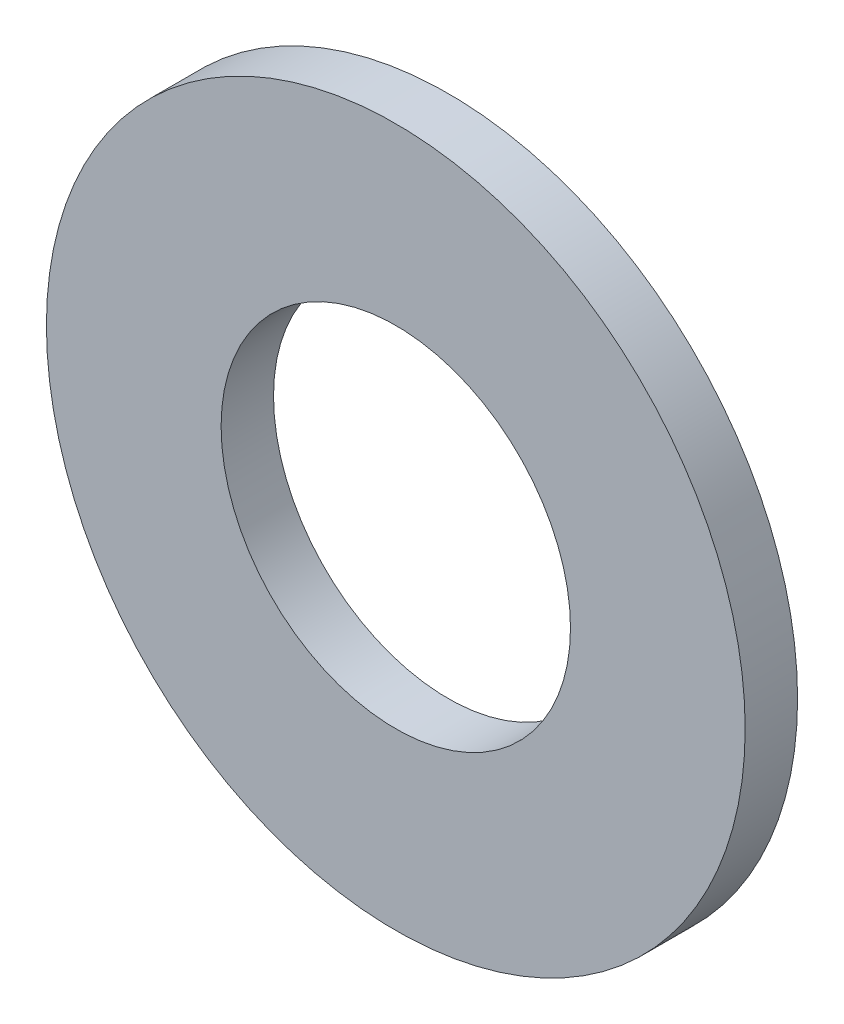
ISO-10303-21;
HEADER;
FILE_DESCRIPTION(('STEP AP214'),'2;1');
FILE_NAME('part.step','',(''),(''),'','','');
FILE_SCHEMA(('AUTOMOTIVE_DESIGN { 1 0 10303 214 1 1 1 1 }'));
ENDSEC;
DATA;
#1=APPLICATION_CONTEXT('core data for automotive mechanical design processes');
#2=APPLICATION_PROTOCOL_DEFINITION('international standard','automotive_design',2000,#1);
#3=PRODUCT_CONTEXT('',#1,'mechanical');
#4=PRODUCT('Part','Part','',(#3));
#5=PRODUCT_RELATED_PRODUCT_CATEGORY('part','',(#4));
#6=PRODUCT_DEFINITION_FORMATION('','',#4);
#7=PRODUCT_DEFINITION_CONTEXT('part definition',#1,'design');
#8=PRODUCT_DEFINITION('design','',#6,#7);
#9=PRODUCT_DEFINITION_SHAPE('','',#8);
#10=(LENGTH_UNIT() NAMED_UNIT(*) SI_UNIT(.MILLI.,.METRE.));
#11=(NAMED_UNIT(*) PLANE_ANGLE_UNIT() SI_UNIT($,.RADIAN.));
#12=(NAMED_UNIT(*) SI_UNIT($,.STERADIAN.) SOLID_ANGLE_UNIT());
#13=UNCERTAINTY_MEASURE_WITH_UNIT(LENGTH_MEASURE(1.E-05),#10,'distance_accuracy_value','');
#14=(GEOMETRIC_REPRESENTATION_CONTEXT(3) GLOBAL_UNCERTAINTY_ASSIGNED_CONTEXT((#13)) GLOBAL_UNIT_ASSIGNED_CONTEXT((#10,
#11,#12)) REPRESENTATION_CONTEXT('',''));
#15=CARTESIAN_POINT('',(0.,0.,0.));
#16=DIRECTION('',(0.,0.,1.));
#17=DIRECTION('',(1.,0.,0.));
#18=AXIS2_PLACEMENT_3D('',#15,#16,#17);
#19=CARTESIAN_POINT('',(0.,0.,0.15));
#20=DIRECTION('',(0.,0.,1.));
#21=DIRECTION('',(1.,0.,0.));
#22=AXIS2_PLACEMENT_3D('',#19,#20,#21);
#23=PLANE('',#22);
#24=CARTESIAN_POINT('',(0.,0.,0.15));
#25=DIRECTION('',(0.,0.,1.));
#26=DIRECTION('',(1.,0.,0.));
#27=AXIS2_PLACEMENT_3D('',#24,#25,#26);
#28=CIRCLE('',#27,2.);
#29=CARTESIAN_POINT('',(2.,0.,0.15));
#30=VERTEX_POINT('',#29);
#31=EDGE_CURVE('E10',#30,#30,#28,.T.);
#32=ORIENTED_EDGE('',*,*,#31,.T.);
#33=EDGE_LOOP('',(#32));
#34=FACE_BOUND('',#33,.T.);
#35=CARTESIAN_POINT('',(0.,0.,0.15));
#36=DIRECTION('',(0.,0.,1.));
#37=DIRECTION('',(1.,0.,0.));
#38=AXIS2_PLACEMENT_3D('',#35,#36,#37);
#39=CIRCLE('',#38,1.);
#40=CARTESIAN_POINT('',(1.,0.,0.15));
#41=VERTEX_POINT('',#40);
#42=EDGE_CURVE('E42',#41,#41,#39,.T.);
#43=ORIENTED_EDGE('',*,*,#42,.F.);
#44=EDGE_LOOP('',(#43));
#45=FACE_BOUND('',#44,.T.);
#46=ADVANCED_FACE('F31',(#34,#45),#23,.T.);
#47=CARTESIAN_POINT('',(0.,0.,-0.15));
#48=DIRECTION('',(0.,0.,1.));
#49=DIRECTION('',(1.,0.,0.));
#50=AXIS2_PLACEMENT_3D('',#47,#48,#49);
#51=PLANE('',#50);
#52=CARTESIAN_POINT('',(0.,0.,-0.15));
#53=DIRECTION('',(0.,0.,1.));
#54=DIRECTION('',(1.,0.,0.));
#55=AXIS2_PLACEMENT_3D('',#52,#53,#54);
#56=CIRCLE('',#55,2.);
#57=CARTESIAN_POINT('',(2.,0.,-0.15));
#58=VERTEX_POINT('',#57);
#59=EDGE_CURVE('E35',#58,#58,#56,.T.);
#60=ORIENTED_EDGE('',*,*,#59,.F.);
#61=EDGE_LOOP('',(#60));
#62=FACE_BOUND('',#61,.T.);
#63=CARTESIAN_POINT('',(0.,0.,-0.15));
#64=DIRECTION('',(0.,0.,1.));
#65=DIRECTION('',(1.,0.,0.));
#66=AXIS2_PLACEMENT_3D('',#63,#64,#65);
#67=CIRCLE('',#66,1.);
#68=CARTESIAN_POINT('',(1.,0.,-0.15));
#69=VERTEX_POINT('',#68);
#70=EDGE_CURVE('E44',#69,#69,#67,.T.);
#71=ORIENTED_EDGE('',*,*,#70,.T.);
#72=EDGE_LOOP('',(#71));
#73=FACE_BOUND('',#72,.T.);
#74=ADVANCED_FACE('F54',(#62,#73),#51,.F.);
#75=CARTESIAN_POINT('',(0.,0.,0.15));
#76=DIRECTION('',(0.,0.,-1.));
#77=DIRECTION('',(-1.,0.,0.));
#78=AXIS2_PLACEMENT_3D('',#75,#76,#77);
#79=CYLINDRICAL_SURFACE('',#78,2.);
#80=ORIENTED_EDGE('',*,*,#31,.F.);
#81=EDGE_LOOP('',(#80));
#82=FACE_BOUND('',#81,.T.);
#83=ORIENTED_EDGE('',*,*,#59,.T.);
#84=EDGE_LOOP('',(#83));
#85=FACE_BOUND('',#84,.T.);
#86=ADVANCED_FACE('F33',(#82,#85),#79,.T.);
#87=CARTESIAN_POINT('',(0.,0.,0.15));
#88=DIRECTION('',(0.,0.,-1.));
#89=DIRECTION('',(-1.,0.,0.));
#90=AXIS2_PLACEMENT_3D('',#87,#88,#89);
#91=CYLINDRICAL_SURFACE('',#90,1.);
#92=ORIENTED_EDGE('',*,*,#42,.T.);
#93=EDGE_LOOP('',(#92));
#94=FACE_BOUND('',#93,.T.);
#95=ORIENTED_EDGE('',*,*,#70,.F.);
#96=EDGE_LOOP('',(#95));
#97=FACE_BOUND('',#96,.T.);
#98=ADVANCED_FACE('F50',(#94,#97),#91,.F.);
#99=CLOSED_SHELL('',(#46,#74,#86,#98));
#100=MANIFOLD_SOLID_BREP('B2',#99);
#101=ADVANCED_BREP_SHAPE_REPRESENTATION('',(#18,#100),#14);
#102=SHAPE_DEFINITION_REPRESENTATION(#9,#101);
ENDSEC;
END-ISO-10303-21;
